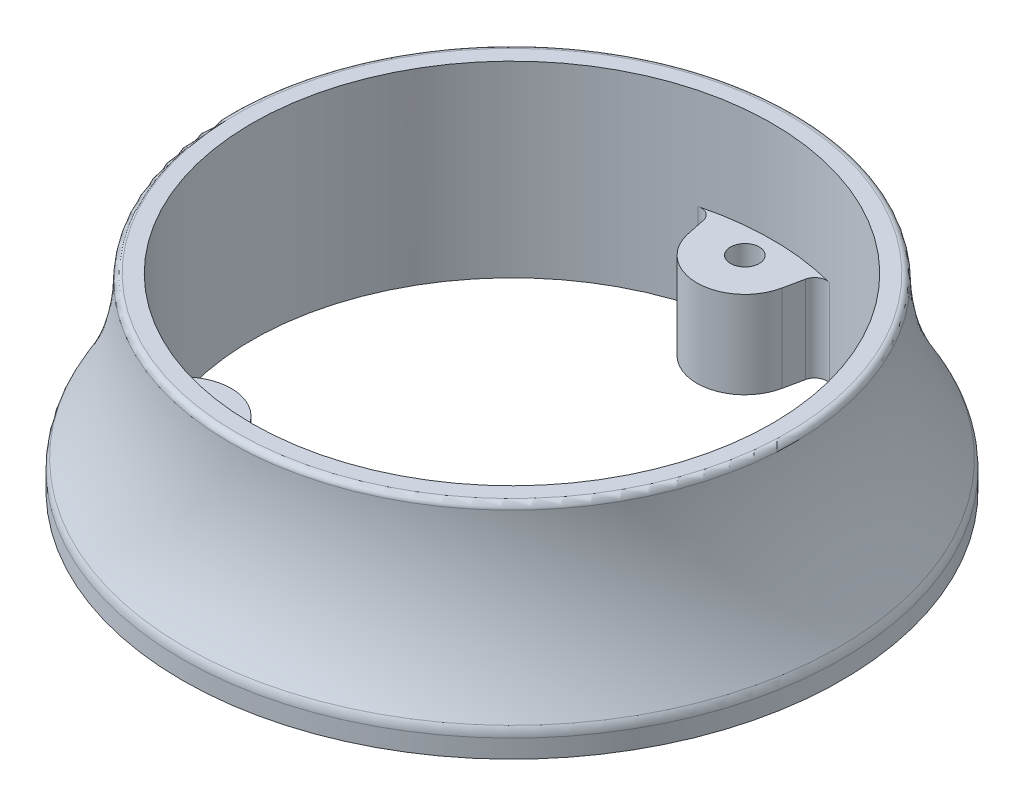
ISO-10303-21;
HEADER;
FILE_DESCRIPTION(('STEP AP214'),'2;1');
FILE_NAME('part.step','',(''),(''),'','','');
FILE_SCHEMA(('AUTOMOTIVE_DESIGN { 1 0 10303 214 1 1 1 1 }'));
ENDSEC;
DATA;
#1=APPLICATION_CONTEXT('core data for automotive mechanical design processes');
#2=APPLICATION_PROTOCOL_DEFINITION('international standard','automotive_design',2000,#1);
#3=PRODUCT_CONTEXT('',#1,'mechanical');
#4=PRODUCT('Part','Part','',(#3));
#5=PRODUCT_RELATED_PRODUCT_CATEGORY('part','',(#4));
#6=PRODUCT_DEFINITION_FORMATION('','',#4);
#7=PRODUCT_DEFINITION_CONTEXT('part definition',#1,'design');
#8=PRODUCT_DEFINITION('design','',#6,#7);
#9=PRODUCT_DEFINITION_SHAPE('','',#8);
#10=(LENGTH_UNIT() NAMED_UNIT(*) SI_UNIT(.MILLI.,.METRE.));
#11=(NAMED_UNIT(*) PLANE_ANGLE_UNIT() SI_UNIT($,.RADIAN.));
#12=(NAMED_UNIT(*) SI_UNIT($,.STERADIAN.) SOLID_ANGLE_UNIT());
#13=UNCERTAINTY_MEASURE_WITH_UNIT(LENGTH_MEASURE(1.E-05),#10,'distance_accuracy_value','');
#14=(GEOMETRIC_REPRESENTATION_CONTEXT(3) GLOBAL_UNCERTAINTY_ASSIGNED_CONTEXT((#13)) GLOBAL_UNIT_ASSIGNED_CONTEXT((#10,
#11,#12)) REPRESENTATION_CONTEXT('',''));
#15=CARTESIAN_POINT('',(0.,0.,0.));
#16=DIRECTION('',(0.,0.,1.));
#17=DIRECTION('',(1.,0.,0.));
#18=AXIS2_PLACEMENT_3D('',#15,#16,#17);
#19=CARTESIAN_POINT('',(0.,8.4,0.));
#20=DIRECTION('',(0.,1.,0.));
#21=DIRECTION('',(0.,0.,1.));
#22=AXIS2_PLACEMENT_3D('',#19,#20,#21);
#23=PLANE('',#22);
#24=CARTESIAN_POINT('',(0.,8.4,0.));
#25=DIRECTION('',(0.,1.,0.));
#26=DIRECTION('',(0.,0.,1.));
#27=AXIS2_PLACEMENT_3D('',#24,#25,#26);
#28=CIRCLE('',#27,23.0046614407208);
#29=CARTESIAN_POINT('',(0.,8.4,23.0046614407208));
#30=VERTEX_POINT('',#29);
#31=EDGE_CURVE('E11',#30,#30,#28,.T.);
#32=ORIENTED_EDGE('',*,*,#31,.T.);
#33=EDGE_LOOP('',(#32));
#34=FACE_BOUND('',#33,.T.);
#35=CARTESIAN_POINT('',(0.,8.4,0.));
#36=DIRECTION('',(0.,1.,0.));
#37=DIRECTION('',(0.,0.,1.));
#38=AXIS2_PLACEMENT_3D('',#35,#36,#37);
#39=CIRCLE('',#38,21.7);
#40=CARTESIAN_POINT('',(0.,8.4,21.7));
#41=VERTEX_POINT('',#40);
#42=CARTESIAN_POINT('',(-5.4879188385711,8.4,-20.9945885127872));
#43=VERTEX_POINT('',#42);
#44=EDGE_CURVE('E24',#41,#43,#39,.T.);
#45=ORIENTED_EDGE('',*,*,#44,.F.);
#46=EDGE_CURVE('E332',#43,#41,#39,.T.);
#47=ORIENTED_EDGE('',*,*,#46,.F.);
#48=EDGE_LOOP('',(#45,#47));
#49=FACE_BOUND('',#48,.T.);
#50=ADVANCED_FACE('F17',(#34,#49),#23,.T.);
#51=CARTESIAN_POINT('',(0.,8.4,0.));
#52=DIRECTION('',(0.,-1.,0.));
#53=DIRECTION('',(0.,0.,-1.));
#54=AXIS2_PLACEMENT_3D('',#51,#52,#53);
#55=CYLINDRICAL_SURFACE('',#54,21.7);
#56=ORIENTED_EDGE('',*,*,#44,.T.);
#57=CARTESIAN_POINT('',(-5.4879188385711,8.4,-20.9945885127872));
#58=CARTESIAN_POINT('',(-5.4879188385711,0.,-20.9945885127872));
#59=B_SPLINE_CURVE_WITH_KNOTS('',1,(#57,#58),.UNSPECIFIED.,.F.,.F.,(2,2),(0.,8.4),.UNSPECIFIED.);
#60=CARTESIAN_POINT('',(-5.48791883857111,0.,-20.9945885127872));
#61=VERTEX_POINT('',#60);
#62=EDGE_CURVE('E330',#43,#61,#59,.T.);
#63=ORIENTED_EDGE('',*,*,#62,.T.);
#64=CARTESIAN_POINT('',(0.,0.,0.));
#65=DIRECTION('',(0.,1.,0.));
#66=DIRECTION('',(0.,0.,1.));
#67=AXIS2_PLACEMENT_3D('',#64,#65,#66);
#68=CIRCLE('',#67,21.7);
#69=CARTESIAN_POINT('',(5.48791883857111,0.,-20.9945885127872));
#70=VERTEX_POINT('',#69);
#71=EDGE_CURVE('E336',#70,#61,#68,.T.);
#72=ORIENTED_EDGE('',*,*,#71,.F.);
#73=DIRECTION('',(0.,1.,0.));
#74=VECTOR('',#73,1.);
#75=CARTESIAN_POINT('',(5.48791883857111,-73.7275569029931,-20.9945885127872));
#76=LINE('',#75,#74);
#77=CARTESIAN_POINT('',(5.48791883857111,-7.2595194714576,-20.9945885127872));
#78=VERTEX_POINT('',#77);
#79=EDGE_CURVE('E338',#78,#70,#76,.T.);
#80=ORIENTED_EDGE('',*,*,#79,.F.);
#81=CARTESIAN_POINT('',(0.,-7.2595194714576,0.));
#82=DIRECTION('',(0.,1.,0.));
#83=DIRECTION('',(0.,0.,-1.));
#84=AXIS2_PLACEMENT_3D('',#81,#82,#83);
#85=CIRCLE('',#84,21.7);
#86=CARTESIAN_POINT('',(17.0181424196839,-7.2595194714576,13.4637598234429));
#87=VERTEX_POINT('',#86);
#88=EDGE_CURVE('E347',#87,#78,#85,.T.);
#89=ORIENTED_EDGE('',*,*,#88,.F.);
#90=DIRECTION('',(0.,1.,0.));
#91=VECTOR('',#90,1.);
#92=CARTESIAN_POINT('',(17.0181424196839,-73.7275569029931,13.4637598234429));
#93=LINE('',#92,#91);
#94=CARTESIAN_POINT('',(17.0181424196839,0.,13.4637598234429));
#95=VERTEX_POINT('',#94);
#96=EDGE_CURVE('E349',#87,#95,#93,.T.);
#97=ORIENTED_EDGE('',*,*,#96,.T.);
#98=CARTESIAN_POINT('',(0.,0.,0.));
#99=DIRECTION('',(0.,1.,0.));
#100=DIRECTION('',(0.,0.,1.));
#101=AXIS2_PLACEMENT_3D('',#98,#99,#100);
#102=CIRCLE('',#101,21.7);
#103=CARTESIAN_POINT('',(8.31635689970461,0.,20.0431586312321));
#104=VERTEX_POINT('',#103);
#105=EDGE_CURVE('E352',#104,#95,#102,.T.);
#106=ORIENTED_EDGE('',*,*,#105,.F.);
#107=DIRECTION('',(0.,1.,0.));
#108=VECTOR('',#107,1.);
#109=CARTESIAN_POINT('',(8.31635689970461,-73.7275569029931,20.0431586312321));
#110=LINE('',#109,#108);
#111=CARTESIAN_POINT('',(8.31635689970461,-7.2595194714576,20.0431586312321));
#112=VERTEX_POINT('',#111);
#113=EDGE_CURVE('E354',#112,#104,#110,.T.);
#114=ORIENTED_EDGE('',*,*,#113,.F.);
#115=CARTESIAN_POINT('',(0.,-7.2595194714576,0.));
#116=DIRECTION('',(0.,1.,0.));
#117=DIRECTION('',(0.,0.,-1.));
#118=AXIS2_PLACEMENT_3D('',#115,#116,#117);
#119=CIRCLE('',#118,21.7);
#120=CARTESIAN_POINT('',(-8.31737878503354,-7.2595194714576,20.0427345975112));
#121=VERTEX_POINT('',#120);
#122=EDGE_CURVE('E356',#121,#112,#119,.T.);
#123=ORIENTED_EDGE('',*,*,#122,.F.);
#124=DIRECTION('',(0.,1.,0.));
#125=VECTOR('',#124,1.);
#126=CARTESIAN_POINT('',(-8.31737878503354,-73.7275569029931,20.0427345975112));
#127=LINE('',#126,#125);
#128=CARTESIAN_POINT('',(-8.31737878503353,0.,20.0427345975112));
#129=VERTEX_POINT('',#128);
#130=EDGE_CURVE('E358',#121,#129,#127,.T.);
#131=ORIENTED_EDGE('',*,*,#130,.T.);
#132=CARTESIAN_POINT('',(0.,0.,0.));
#133=DIRECTION('',(0.,1.,0.));
#134=DIRECTION('',(0.,0.,1.));
#135=AXIS2_PLACEMENT_3D('',#132,#133,#134);
#136=CIRCLE('',#135,21.7);
#137=CARTESIAN_POINT('',(-17.0174559506621,0.,13.4646274722798));
#138=VERTEX_POINT('',#137);
#139=EDGE_CURVE('E361',#138,#129,#136,.T.);
#140=ORIENTED_EDGE('',*,*,#139,.F.);
#141=DIRECTION('',(0.,1.,0.));
#142=VECTOR('',#141,1.);
#143=CARTESIAN_POINT('',(-17.0174559506621,-73.7275569029931,13.4646274722798));
#144=LINE('',#143,#142);
#145=CARTESIAN_POINT('',(-17.0174559506621,-7.2595194714576,13.4646274722798));
#146=VERTEX_POINT('',#145);
#147=EDGE_CURVE('E363',#146,#138,#144,.T.);
#148=ORIENTED_EDGE('',*,*,#147,.F.);
#149=CARTESIAN_POINT('',(0.,-7.2595194714576,0.));
#150=DIRECTION('',(0.,1.,0.));
#151=DIRECTION('',(0.,0.,-1.));
#152=AXIS2_PLACEMENT_3D('',#149,#150,#151);
#153=CIRCLE('',#152,21.7);
#154=CARTESIAN_POINT('',(-5.48791883857111,-7.2595194714576,-20.9945885127872));
#155=VERTEX_POINT('',#154);
#156=EDGE_CURVE('E365',#155,#146,#153,.T.);
#157=ORIENTED_EDGE('',*,*,#156,.F.);
#158=DIRECTION('',(0.,1.,0.));
#159=VECTOR('',#158,1.);
#160=CARTESIAN_POINT('',(-5.48791883857111,-73.7275569029931,-20.9945885127872));
#161=LINE('',#160,#159);
#162=EDGE_CURVE('E334',#155,#61,#161,.T.);
#163=ORIENTED_EDGE('',*,*,#162,.T.);
#164=ORIENTED_EDGE('',*,*,#62,.F.);
#165=ORIENTED_EDGE('',*,*,#46,.T.);
#166=EDGE_LOOP('',(#56,#63,#72,#80,#89,#97,#106,#114,#123,#131,#140,#148,#157,#163,#164,#165));
#167=FACE_BOUND('',#166,.T.);
#168=ADVANCED_FACE('F320',(#167),#55,.F.);
#169=CARTESIAN_POINT('',(0.,0.,0.));
#170=DIRECTION('',(0.,1.,0.));
#171=DIRECTION('',(0.,0.,1.));
#172=AXIS2_PLACEMENT_3D('',#169,#170,#171);
#173=PLANE('',#172);
#174=CARTESIAN_POINT('',(11.811,0.,15.621));
#175=DIRECTION('',(0.,1.,0.));
#176=DIRECTION('',(0.,0.,1.));
#177=AXIS2_PLACEMENT_3D('',#174,#175,#176);
#178=CIRCLE('',#177,1.2);
#179=CARTESIAN_POINT('',(11.811,0.,16.821));
#180=VERTEX_POINT('',#179);
#181=EDGE_CURVE('E368',#180,#180,#178,.T.);
#182=ORIENTED_EDGE('',*,*,#181,.F.);
#183=EDGE_LOOP('',(#182));
#184=FACE_BOUND('',#183,.T.);
#185=CARTESIAN_POINT('',(7.933114646262,0.,19.1195107680417));
#186=DIRECTION('',(0.,1.,0.));
#187=DIRECTION('',(0.,0.,-1.));
#188=AXIS2_PLACEMENT_3D('',#185,#186,#187);
#189=CIRCLE('',#188,1.);
#190=CARTESIAN_POINT('',(8.83716996740658,0.,18.692095307032));
#191=VERTEX_POINT('',#190);
#192=EDGE_CURVE('E370',#104,#191,#189,.T.);
#193=ORIENTED_EDGE('',*,*,#192,.F.);
#194=ORIENTED_EDGE('',*,*,#105,.T.);
#195=CARTESIAN_POINT('',(16.2338962252284,0.,12.843310061994));
#196=DIRECTION('',(0.,1.,0.));
#197=DIRECTION('',(0.,0.,1.));
#198=AXIS2_PLACEMENT_3D('',#195,#196,#197);
#199=CIRCLE('',#198,1.);
#200=CARTESIAN_POINT('',(15.576284592711,0.,13.5966671757042));
#201=VERTEX_POINT('',#200);
#202=EDGE_CURVE('E372',#201,#95,#199,.T.);
#203=ORIENTED_EDGE('',*,*,#202,.F.);
#204=DIRECTION('',(0.753357113710265,0.,0.657611632517354));
#205=VECTOR('',#204,1.);
#206=CARTESIAN_POINT('',(14.4421965240399,0.,12.6067123552283));
#207=LINE('',#206,#205);
#208=CARTESIAN_POINT('',(14.4421965240399,0.,12.6067123552283));
#209=VERTEX_POINT('',#208);
#210=EDGE_CURVE('E375',#209,#201,#207,.T.);
#211=ORIENTED_EDGE('',*,*,#210,.F.);
#212=CARTESIAN_POINT('',(11.811,0.,15.621));
#213=DIRECTION('',(0.,-1.,0.));
#214=DIRECTION('',(0.,0.,1.));
#215=AXIS2_PLACEMENT_3D('',#212,#213,#214);
#216=CIRCLE('',#215,4.00114048160556);
#217=CARTESIAN_POINT('',(8.1937476569575,0.,17.3311493035102));
#218=VERTEX_POINT('',#217);
#219=EDGE_CURVE('E378',#218,#209,#216,.T.);
#220=ORIENTED_EDGE('',*,*,#219,.F.);
#221=DIRECTION('',(-0.427415461009738,0.,-0.904055321144582));
#222=VECTOR('',#221,1.);
#223=CARTESIAN_POINT('',(8.1937476569575,0.,17.3311493035102));
#224=LINE('',#223,#222);
#225=EDGE_CURVE('E381',#191,#218,#224,.T.);
#226=ORIENTED_EDGE('',*,*,#225,.F.);
#227=EDGE_LOOP('',(#193,#194,#203,#211,#220,#226));
#228=FACE_BOUND('',#227,.T.);
#229=ADVANCED_FACE('F317',(#184,#228),#173,.T.);
#230=CARTESIAN_POINT('',(0.,0.,0.));
#231=DIRECTION('',(0.,1.,0.));
#232=DIRECTION('',(0.,0.,1.));
#233=AXIS2_PLACEMENT_3D('',#230,#231,#232);
#234=PLANE('',#233);
#235=CARTESIAN_POINT('',(0.,0.,-19.431));
#236=DIRECTION('',(0.,1.,0.));
#237=DIRECTION('',(0.,0.,1.));
#238=AXIS2_PLACEMENT_3D('',#235,#236,#237);
#239=CIRCLE('',#238,1.2);
#240=CARTESIAN_POINT('',(0.,0.,-18.231));
#241=VERTEX_POINT('',#240);
#242=EDGE_CURVE('E384',#241,#241,#239,.T.);
#243=ORIENTED_EDGE('',*,*,#242,.F.);
#244=EDGE_LOOP('',(#243));
#245=FACE_BOUND('',#244,.T.);
#246=CARTESIAN_POINT('',(5.23501935292267,0.,-20.0270959545942));
#247=DIRECTION('',(0.,1.,0.));
#248=DIRECTION('',(0.,0.,-1.));
#249=AXIS2_PLACEMENT_3D('',#246,#247,#248);
#250=CIRCLE('',#249,1.);
#251=CARTESIAN_POINT('',(4.25643904354521,0.,-20.2329613914667));
#252=VERTEX_POINT('',#251);
#253=EDGE_CURVE('E386',#70,#252,#250,.T.);
#254=ORIENTED_EDGE('',*,*,#253,.F.);
#255=ORIENTED_EDGE('',*,*,#71,.T.);
#256=CARTESIAN_POINT('',(-5.23501935292267,0.,-20.0270959545942));
#257=DIRECTION('',(0.,1.,0.));
#258=DIRECTION('',(0.,0.,1.));
#259=AXIS2_PLACEMENT_3D('',#256,#257,#258);
#260=CIRCLE('',#259,1.);
#261=CARTESIAN_POINT('',(-4.25643904354521,0.,-20.2329613914667));
#262=VERTEX_POINT('',#261);
#263=EDGE_CURVE('E388',#262,#61,#260,.T.);
#264=ORIENTED_EDGE('',*,*,#263,.F.);
#265=DIRECTION('',(-0.205865436872503,0.,-0.978580309377464));
#266=VECTOR('',#265,1.);
#267=CARTESIAN_POINT('',(-3.91448887210358,0.,-18.6075029869641));
#268=LINE('',#267,#266);
#269=CARTESIAN_POINT('',(-3.91448887210358,0.,-18.6075029869641));
#270=VERTEX_POINT('',#269);
#271=EDGE_CURVE('E391',#270,#262,#268,.T.);
#272=ORIENTED_EDGE('',*,*,#271,.F.);
#273=CARTESIAN_POINT('',(0.,0.,-19.431));
#274=DIRECTION('',(0.,-1.,0.));
#275=DIRECTION('',(0.,0.,1.));
#276=AXIS2_PLACEMENT_3D('',#273,#274,#275);
#277=CIRCLE('',#276,4.0001713038696);
#278=CARTESIAN_POINT('',(3.91448887210358,0.,-18.6075029869641));
#279=VERTEX_POINT('',#278);
#280=EDGE_CURVE('E394',#279,#270,#277,.T.);
#281=ORIENTED_EDGE('',*,*,#280,.F.);
#282=DIRECTION('',(-0.205865436872503,0.,0.978580309377464));
#283=VECTOR('',#282,1.);
#284=CARTESIAN_POINT('',(3.91448887210358,0.,-18.6075029869641));
#285=LINE('',#284,#283);
#286=EDGE_CURVE('E397',#252,#279,#285,.T.);
#287=ORIENTED_EDGE('',*,*,#286,.F.);
#288=EDGE_LOOP('',(#254,#255,#264,#272,#281,#287));
#289=FACE_BOUND('',#288,.T.);
#290=ADVANCED_FACE('F313',(#245,#289),#234,.T.);
#291=CARTESIAN_POINT('',(0.,0.,0.));
#292=DIRECTION('',(0.,1.,0.));
#293=DIRECTION('',(0.,0.,1.));
#294=AXIS2_PLACEMENT_3D('',#291,#292,#293);
#295=PLANE('',#294);
#296=CARTESIAN_POINT('',(-11.811,0.,15.621));
#297=DIRECTION('',(0.,1.,0.));
#298=DIRECTION('',(0.,0.,1.));
#299=AXIS2_PLACEMENT_3D('',#296,#297,#298);
#300=CIRCLE('',#299,1.2);
#301=CARTESIAN_POINT('',(-11.811,0.,16.821));
#302=VERTEX_POINT('',#301);
#303=EDGE_CURVE('E400',#302,#302,#300,.T.);
#304=ORIENTED_EDGE('',*,*,#303,.F.);
#305=EDGE_LOOP('',(#304));
#306=FACE_BOUND('',#305,.T.);
#307=CARTESIAN_POINT('',(-16.2332413907238,0.,12.8441377270135));
#308=DIRECTION('',(0.,1.,0.));
#309=DIRECTION('',(0.,0.,-1.));
#310=AXIS2_PLACEMENT_3D('',#307,#308,#309);
#311=CIRCLE('',#310,1.);
#312=CARTESIAN_POINT('',(-15.5755913493106,0.,13.5974613115568));
#313=VERTEX_POINT('',#312);
#314=EDGE_CURVE('E402',#138,#313,#311,.T.);
#315=ORIENTED_EDGE('',*,*,#314,.F.);
#316=ORIENTED_EDGE('',*,*,#139,.T.);
#317=CARTESIAN_POINT('',(-7.93408944010111,0.,19.1191062750453));
#318=DIRECTION('',(0.,1.,0.));
#319=DIRECTION('',(0.,0.,1.));
#320=AXIS2_PLACEMENT_3D('',#317,#318,#319);
#321=CIRCLE('',#320,1.);
#322=CARTESIAN_POINT('',(-8.83812296838519,0.,18.6916447215247));
#323=VERTEX_POINT('',#322);
#324=EDGE_CURVE('E404',#323,#129,#321,.T.);
#325=ORIENTED_EDGE('',*,*,#324,.F.);
#326=DIRECTION('',(-0.427461553520588,0.,0.904033528284082));
#327=VECTOR('',#326,1.);
#328=CARTESIAN_POINT('',(-8.19471846157961,0.,17.3309159223829));
#329=LINE('',#328,#327);
#330=CARTESIAN_POINT('',(-8.19471846157961,0.,17.3309159223829));
#331=VERTEX_POINT('',#330);
#332=EDGE_CURVE('E407',#331,#323,#329,.T.);
#333=ORIENTED_EDGE('',*,*,#332,.F.);
#334=CARTESIAN_POINT('',(-11.811,0.,15.621));
#335=DIRECTION('',(0.,-1.,0.));
#336=DIRECTION('',(0.,0.,1.));
#337=AXIS2_PLACEMENT_3D('',#334,#335,#336);
#338=CIRCLE('',#337,4.00016307501818);
#339=CARTESIAN_POINT('',(-14.4417074119456,0.,12.6075828135697));
#340=VERTEX_POINT('',#339);
#341=EDGE_CURVE('E410',#340,#331,#338,.T.);
#342=ORIENTED_EDGE('',*,*,#341,.F.);
#343=DIRECTION('',(0.753323584543268,0.,-0.657650041413275));
#344=VECTOR('',#343,1.);
#345=CARTESIAN_POINT('',(-14.4417074119456,0.,12.6075828135697));
#346=LINE('',#345,#344);
#347=EDGE_CURVE('E413',#313,#340,#346,.T.);
#348=ORIENTED_EDGE('',*,*,#347,.F.);
#349=EDGE_LOOP('',(#315,#316,#325,#333,#342,#348));
#350=FACE_BOUND('',#349,.T.);
#351=ADVANCED_FACE('F309',(#306,#350),#295,.T.);
#352=CARTESIAN_POINT('',(-5.23501935292267,-73.7275569029931,-20.0270959545942));
#353=DIRECTION('',(0.,1.,0.));
#354=DIRECTION('',(0.,0.,1.));
#355=AXIS2_PLACEMENT_3D('',#352,#353,#354);
#356=CYLINDRICAL_SURFACE('',#355,1.);
#357=CARTESIAN_POINT('',(-5.23501935292267,-7.2595194714576,-20.0270959545942));
#358=DIRECTION('',(0.,1.,0.));
#359=DIRECTION('',(0.,0.,-1.));
#360=AXIS2_PLACEMENT_3D('',#357,#358,#359);
#361=CIRCLE('',#360,1.);
#362=CARTESIAN_POINT('',(-4.25643904354521,-7.2595194714576,-20.2329613914667));
#363=VERTEX_POINT('',#362);
#364=EDGE_CURVE('E416',#363,#155,#361,.T.);
#365=ORIENTED_EDGE('',*,*,#364,.F.);
#366=DIRECTION('',(0.,1.,0.));
#367=VECTOR('',#366,1.);
#368=CARTESIAN_POINT('',(-4.25643904354521,-73.7275569029931,-20.2329613914667));
#369=LINE('',#368,#367);
#370=EDGE_CURVE('E419',#363,#262,#369,.T.);
#371=ORIENTED_EDGE('',*,*,#370,.T.);
#372=ORIENTED_EDGE('',*,*,#263,.T.);
#373=ORIENTED_EDGE('',*,*,#162,.F.);
#374=EDGE_LOOP('',(#365,#371,#372,#373));
#375=FACE_BOUND('',#374,.T.);
#376=ADVANCED_FACE('F305',(#375),#356,.F.);
#377=CARTESIAN_POINT('',(-3.91448887210358,-73.7275569029931,-18.6075029869641));
#378=DIRECTION('',(0.978580309377464,0.,-0.205865436872503));
#379=DIRECTION('',(-0.205865436872503,0.,-0.978580309377464));
#380=AXIS2_PLACEMENT_3D('',#377,#378,#379);
#381=PLANE('',#380);
#382=DIRECTION('',(-0.205865436872503,0.,-0.978580309377464));
#383=VECTOR('',#382,1.);
#384=CARTESIAN_POINT('',(-3.91448887210358,-7.2595194714576,-18.6075029869641));
#385=LINE('',#384,#383);
#386=CARTESIAN_POINT('',(-3.91448887210358,-7.2595194714576,-18.6075029869641));
#387=VERTEX_POINT('',#386);
#388=EDGE_CURVE('E422',#387,#363,#385,.T.);
#389=ORIENTED_EDGE('',*,*,#388,.F.);
#390=DIRECTION('',(0.,1.,0.));
#391=VECTOR('',#390,1.);
#392=CARTESIAN_POINT('',(-3.91448887210358,-73.7275569029931,-18.6075029869641));
#393=LINE('',#392,#391);
#394=EDGE_CURVE('E425',#387,#270,#393,.T.);
#395=ORIENTED_EDGE('',*,*,#394,.T.);
#396=ORIENTED_EDGE('',*,*,#271,.T.);
#397=ORIENTED_EDGE('',*,*,#370,.F.);
#398=EDGE_LOOP('',(#389,#395,#396,#397));
#399=FACE_BOUND('',#398,.T.);
#400=ADVANCED_FACE('F301',(#399),#381,.F.);
#401=CARTESIAN_POINT('',(0.,-73.7275569029931,-19.431));
#402=DIRECTION('',(0.,1.,0.));
#403=DIRECTION('',(0.,0.,1.));
#404=AXIS2_PLACEMENT_3D('',#401,#402,#403);
#405=CYLINDRICAL_SURFACE('',#404,4.0001713038696);
#406=CARTESIAN_POINT('',(0.,-7.2595194714576,-19.431));
#407=DIRECTION('',(0.,-1.,0.));
#408=DIRECTION('',(0.,0.,-1.));
#409=AXIS2_PLACEMENT_3D('',#406,#407,#408);
#410=CIRCLE('',#409,4.0001713038696);
#411=CARTESIAN_POINT('',(3.91448887210358,-7.2595194714576,-18.6075029869641));
#412=VERTEX_POINT('',#411);
#413=EDGE_CURVE('E428',#412,#387,#410,.T.);
#414=ORIENTED_EDGE('',*,*,#413,.F.);
#415=DIRECTION('',(0.,1.,0.));
#416=VECTOR('',#415,1.);
#417=CARTESIAN_POINT('',(3.91448887210358,-73.7275569029931,-18.6075029869641));
#418=LINE('',#417,#416);
#419=EDGE_CURVE('E431',#412,#279,#418,.T.);
#420=ORIENTED_EDGE('',*,*,#419,.T.);
#421=ORIENTED_EDGE('',*,*,#280,.T.);
#422=ORIENTED_EDGE('',*,*,#394,.F.);
#423=EDGE_LOOP('',(#414,#420,#421,#422));
#424=FACE_BOUND('',#423,.T.);
#425=ADVANCED_FACE('F297',(#424),#405,.T.);
#426=CARTESIAN_POINT('',(3.91448887210358,-73.7275569029931,-18.6075029869641));
#427=DIRECTION('',(-0.978580309377464,0.,-0.205865436872503));
#428=DIRECTION('',(-0.205865436872503,0.,0.978580309377464));
#429=AXIS2_PLACEMENT_3D('',#426,#427,#428);
#430=PLANE('',#429);
#431=DIRECTION('',(-0.205865436872503,0.,0.978580309377464));
#432=VECTOR('',#431,1.);
#433=CARTESIAN_POINT('',(3.91448887210358,-7.2595194714576,-18.6075029869641));
#434=LINE('',#433,#432);
#435=CARTESIAN_POINT('',(4.25643904354521,-7.2595194714576,-20.2329613914667));
#436=VERTEX_POINT('',#435);
#437=EDGE_CURVE('E434',#436,#412,#434,.T.);
#438=ORIENTED_EDGE('',*,*,#437,.F.);
#439=DIRECTION('',(0.,1.,0.));
#440=VECTOR('',#439,1.);
#441=CARTESIAN_POINT('',(4.25643904354521,-73.7275569029931,-20.2329613914667));
#442=LINE('',#441,#440);
#443=EDGE_CURVE('E437',#436,#252,#442,.T.);
#444=ORIENTED_EDGE('',*,*,#443,.T.);
#445=ORIENTED_EDGE('',*,*,#286,.T.);
#446=ORIENTED_EDGE('',*,*,#419,.F.);
#447=EDGE_LOOP('',(#438,#444,#445,#446));
#448=FACE_BOUND('',#447,.T.);
#449=ADVANCED_FACE('F293',(#448),#430,.F.);
#450=CARTESIAN_POINT('',(5.23501935292267,-73.7275569029931,-20.0270959545942));
#451=DIRECTION('',(0.,1.,0.));
#452=DIRECTION('',(0.,0.,1.));
#453=AXIS2_PLACEMENT_3D('',#450,#451,#452);
#454=CYLINDRICAL_SURFACE('',#453,1.);
#455=CARTESIAN_POINT('',(5.23501935292267,-7.2595194714576,-20.0270959545942));
#456=DIRECTION('',(0.,1.,0.));
#457=DIRECTION('',(0.,0.,-1.));
#458=AXIS2_PLACEMENT_3D('',#455,#456,#457);
#459=CIRCLE('',#458,1.);
#460=EDGE_CURVE('E440',#78,#436,#459,.T.);
#461=ORIENTED_EDGE('',*,*,#460,.F.);
#462=ORIENTED_EDGE('',*,*,#79,.T.);
#463=ORIENTED_EDGE('',*,*,#253,.T.);
#464=ORIENTED_EDGE('',*,*,#443,.F.);
#465=EDGE_LOOP('',(#461,#462,#463,#464));
#466=FACE_BOUND('',#465,.T.);
#467=ADVANCED_FACE('F289',(#466),#454,.F.);
#468=CARTESIAN_POINT('',(16.2338962252284,-73.7275569029931,12.843310061994));
#469=DIRECTION('',(0.,1.,0.));
#470=DIRECTION('',(0.,0.,1.));
#471=AXIS2_PLACEMENT_3D('',#468,#469,#470);
#472=CYLINDRICAL_SURFACE('',#471,1.);
#473=CARTESIAN_POINT('',(16.2338962252284,-7.2595194714576,12.843310061994));
#474=DIRECTION('',(0.,1.,0.));
#475=DIRECTION('',(0.,0.,-1.));
#476=AXIS2_PLACEMENT_3D('',#473,#474,#475);
#477=CIRCLE('',#476,1.);
#478=CARTESIAN_POINT('',(15.576284592711,-7.2595194714576,13.5966671757042));
#479=VERTEX_POINT('',#478);
#480=EDGE_CURVE('E443',#479,#87,#477,.T.);
#481=ORIENTED_EDGE('',*,*,#480,.F.);
#482=DIRECTION('',(0.,1.,0.));
#483=VECTOR('',#482,1.);
#484=CARTESIAN_POINT('',(15.576284592711,-73.7275569029931,13.5966671757042));
#485=LINE('',#484,#483);
#486=EDGE_CURVE('E446',#479,#201,#485,.T.);
#487=ORIENTED_EDGE('',*,*,#486,.T.);
#488=ORIENTED_EDGE('',*,*,#202,.T.);
#489=ORIENTED_EDGE('',*,*,#96,.F.);
#490=EDGE_LOOP('',(#481,#487,#488,#489));
#491=FACE_BOUND('',#490,.T.);
#492=ADVANCED_FACE('F285',(#491),#472,.F.);
#493=CARTESIAN_POINT('',(14.4421965240399,-73.7275569029931,12.6067123552283));
#494=DIRECTION('',(-0.657611632517354,0.,0.753357113710265));
#495=DIRECTION('',(0.753357113710265,0.,0.657611632517354));
#496=AXIS2_PLACEMENT_3D('',#493,#494,#495);
#497=PLANE('',#496);
#498=DIRECTION('',(0.753357113710265,0.,0.657611632517354));
#499=VECTOR('',#498,1.);
#500=CARTESIAN_POINT('',(14.4421965240399,-7.2595194714576,12.6067123552283));
#501=LINE('',#500,#499);
#502=CARTESIAN_POINT('',(14.4421965240399,-7.2595194714576,12.6067123552283));
#503=VERTEX_POINT('',#502);
#504=EDGE_CURVE('E449',#503,#479,#501,.T.);
#505=ORIENTED_EDGE('',*,*,#504,.F.);
#506=DIRECTION('',(0.,1.,0.));
#507=VECTOR('',#506,1.);
#508=CARTESIAN_POINT('',(14.4421965240399,-73.7275569029931,12.6067123552283));
#509=LINE('',#508,#507);
#510=EDGE_CURVE('E452',#503,#209,#509,.T.);
#511=ORIENTED_EDGE('',*,*,#510,.T.);
#512=ORIENTED_EDGE('',*,*,#210,.T.);
#513=ORIENTED_EDGE('',*,*,#486,.F.);
#514=EDGE_LOOP('',(#505,#511,#512,#513));
#515=FACE_BOUND('',#514,.T.);
#516=ADVANCED_FACE('F281',(#515),#497,.F.);
#517=CARTESIAN_POINT('',(11.811,-73.7275569029931,15.621));
#518=DIRECTION('',(0.,1.,0.));
#519=DIRECTION('',(0.,0.,1.));
#520=AXIS2_PLACEMENT_3D('',#517,#518,#519);
#521=CYLINDRICAL_SURFACE('',#520,4.00114048160556);
#522=CARTESIAN_POINT('',(11.811,-7.2595194714576,15.621));
#523=DIRECTION('',(0.,-1.,0.));
#524=DIRECTION('',(0.,0.,-1.));
#525=AXIS2_PLACEMENT_3D('',#522,#523,#524);
#526=CIRCLE('',#525,4.00114048160556);
#527=CARTESIAN_POINT('',(8.1937476569575,-7.2595194714576,17.3311493035102));
#528=VERTEX_POINT('',#527);
#529=EDGE_CURVE('E455',#528,#503,#526,.T.);
#530=ORIENTED_EDGE('',*,*,#529,.F.);
#531=DIRECTION('',(0.,1.,0.));
#532=VECTOR('',#531,1.);
#533=CARTESIAN_POINT('',(8.1937476569575,-73.7275569029931,17.3311493035102));
#534=LINE('',#533,#532);
#535=EDGE_CURVE('E458',#528,#218,#534,.T.);
#536=ORIENTED_EDGE('',*,*,#535,.T.);
#537=ORIENTED_EDGE('',*,*,#219,.T.);
#538=ORIENTED_EDGE('',*,*,#510,.F.);
#539=EDGE_LOOP('',(#530,#536,#537,#538));
#540=FACE_BOUND('',#539,.T.);
#541=ADVANCED_FACE('F277',(#540),#521,.T.);
#542=CARTESIAN_POINT('',(8.1937476569575,-73.7275569029931,17.3311493035102));
#543=DIRECTION('',(0.904055321144582,0.,-0.427415461009738));
#544=DIRECTION('',(-0.427415461009738,0.,-0.904055321144582));
#545=AXIS2_PLACEMENT_3D('',#542,#543,#544);
#546=PLANE('',#545);
#547=DIRECTION('',(-0.427415461009738,0.,-0.904055321144582));
#548=VECTOR('',#547,1.);
#549=CARTESIAN_POINT('',(8.19374765695749,-7.2595194714576,17.3311493035102));
#550=LINE('',#549,#548);
#551=CARTESIAN_POINT('',(8.83716996740658,-7.2595194714576,18.692095307032));
#552=VERTEX_POINT('',#551);
#553=EDGE_CURVE('E461',#552,#528,#550,.T.);
#554=ORIENTED_EDGE('',*,*,#553,.F.);
#555=DIRECTION('',(0.,1.,0.));
#556=VECTOR('',#555,1.);
#557=CARTESIAN_POINT('',(8.83716996740658,-73.7275569029931,18.692095307032));
#558=LINE('',#557,#556);
#559=EDGE_CURVE('E464',#552,#191,#558,.T.);
#560=ORIENTED_EDGE('',*,*,#559,.T.);
#561=ORIENTED_EDGE('',*,*,#225,.T.);
#562=ORIENTED_EDGE('',*,*,#535,.F.);
#563=EDGE_LOOP('',(#554,#560,#561,#562));
#564=FACE_BOUND('',#563,.T.);
#565=ADVANCED_FACE('F273',(#564),#546,.F.);
#566=CARTESIAN_POINT('',(7.933114646262,-73.7275569029931,19.1195107680417));
#567=DIRECTION('',(0.,1.,0.));
#568=DIRECTION('',(0.,0.,1.));
#569=AXIS2_PLACEMENT_3D('',#566,#567,#568);
#570=CYLINDRICAL_SURFACE('',#569,1.);
#571=CARTESIAN_POINT('',(7.933114646262,-7.2595194714576,19.1195107680417));
#572=DIRECTION('',(0.,1.,0.));
#573=DIRECTION('',(0.,0.,-1.));
#574=AXIS2_PLACEMENT_3D('',#571,#572,#573);
#575=CIRCLE('',#574,1.);
#576=EDGE_CURVE('E467',#112,#552,#575,.T.);
#577=ORIENTED_EDGE('',*,*,#576,.F.);
#578=ORIENTED_EDGE('',*,*,#113,.T.);
#579=ORIENTED_EDGE('',*,*,#192,.T.);
#580=ORIENTED_EDGE('',*,*,#559,.F.);
#581=EDGE_LOOP('',(#577,#578,#579,#580));
#582=FACE_BOUND('',#581,.T.);
#583=ADVANCED_FACE('F269',(#582),#570,.F.);
#584=CARTESIAN_POINT('',(-7.93408944010111,-73.7275569029931,19.1191062750453));
#585=DIRECTION('',(0.,1.,0.));
#586=DIRECTION('',(0.,0.,1.));
#587=AXIS2_PLACEMENT_3D('',#584,#585,#586);
#588=CYLINDRICAL_SURFACE('',#587,1.);
#589=CARTESIAN_POINT('',(-7.93408944010111,-7.2595194714576,19.1191062750453));
#590=DIRECTION('',(0.,1.,0.));
#591=DIRECTION('',(0.,0.,-1.));
#592=AXIS2_PLACEMENT_3D('',#589,#590,#591);
#593=CIRCLE('',#592,1.);
#594=CARTESIAN_POINT('',(-8.83812296838519,-7.2595194714576,18.6916447215247));
#595=VERTEX_POINT('',#594);
#596=EDGE_CURVE('E470',#595,#121,#593,.T.);
#597=ORIENTED_EDGE('',*,*,#596,.F.);
#598=DIRECTION('',(0.,1.,0.));
#599=VECTOR('',#598,1.);
#600=CARTESIAN_POINT('',(-8.83812296838519,-73.7275569029931,18.6916447215247));
#601=LINE('',#600,#599);
#602=EDGE_CURVE('E473',#595,#323,#601,.T.);
#603=ORIENTED_EDGE('',*,*,#602,.T.);
#604=ORIENTED_EDGE('',*,*,#324,.T.);
#605=ORIENTED_EDGE('',*,*,#130,.F.);
#606=EDGE_LOOP('',(#597,#603,#604,#605));
#607=FACE_BOUND('',#606,.T.);
#608=ADVANCED_FACE('F265',(#607),#588,.F.);
#609=CARTESIAN_POINT('',(-8.19471846157961,-73.7275569029931,17.3309159223829));
#610=DIRECTION('',(-0.904033528284082,0.,-0.427461553520588));
#611=DIRECTION('',(-0.427461553520588,0.,0.904033528284082));
#612=AXIS2_PLACEMENT_3D('',#609,#610,#611);
#613=PLANE('',#612);
#614=DIRECTION('',(-0.427461553520588,0.,0.904033528284082));
#615=VECTOR('',#614,1.);
#616=CARTESIAN_POINT('',(-8.19471846157961,-7.2595194714576,17.3309159223829));
#617=LINE('',#616,#615);
#618=CARTESIAN_POINT('',(-8.19471846157961,-7.2595194714576,17.3309159223829));
#619=VERTEX_POINT('',#618);
#620=EDGE_CURVE('E476',#619,#595,#617,.T.);
#621=ORIENTED_EDGE('',*,*,#620,.F.);
#622=DIRECTION('',(0.,1.,0.));
#623=VECTOR('',#622,1.);
#624=CARTESIAN_POINT('',(-8.19471846157961,-73.7275569029931,17.3309159223829));
#625=LINE('',#624,#623);
#626=EDGE_CURVE('E479',#619,#331,#625,.T.);
#627=ORIENTED_EDGE('',*,*,#626,.T.);
#628=ORIENTED_EDGE('',*,*,#332,.T.);
#629=ORIENTED_EDGE('',*,*,#602,.F.);
#630=EDGE_LOOP('',(#621,#627,#628,#629));
#631=FACE_BOUND('',#630,.T.);
#632=ADVANCED_FACE('F261',(#631),#613,.F.);
#633=CARTESIAN_POINT('',(-11.811,-73.7275569029931,15.621));
#634=DIRECTION('',(0.,1.,0.));
#635=DIRECTION('',(0.,0.,1.));
#636=AXIS2_PLACEMENT_3D('',#633,#634,#635);
#637=CYLINDRICAL_SURFACE('',#636,4.00016307501818);
#638=CARTESIAN_POINT('',(-11.811,-7.2595194714576,15.621));
#639=DIRECTION('',(0.,-1.,0.));
#640=DIRECTION('',(0.,0.,-1.));
#641=AXIS2_PLACEMENT_3D('',#638,#639,#640);
#642=CIRCLE('',#641,4.00016307501818);
#643=CARTESIAN_POINT('',(-14.4417074119456,-7.2595194714576,12.6075828135697));
#644=VERTEX_POINT('',#643);
#645=EDGE_CURVE('E482',#644,#619,#642,.T.);
#646=ORIENTED_EDGE('',*,*,#645,.F.);
#647=DIRECTION('',(0.,1.,0.));
#648=VECTOR('',#647,1.);
#649=CARTESIAN_POINT('',(-14.4417074119456,-73.7275569029931,12.6075828135697));
#650=LINE('',#649,#648);
#651=EDGE_CURVE('E485',#644,#340,#650,.T.);
#652=ORIENTED_EDGE('',*,*,#651,.T.);
#653=ORIENTED_EDGE('',*,*,#341,.T.);
#654=ORIENTED_EDGE('',*,*,#626,.F.);
#655=EDGE_LOOP('',(#646,#652,#653,#654));
#656=FACE_BOUND('',#655,.T.);
#657=ADVANCED_FACE('F257',(#656),#637,.T.);
#658=CARTESIAN_POINT('',(-14.4417074119456,-73.7275569029931,12.6075828135697));
#659=DIRECTION('',(0.657650041413275,0.,0.753323584543268));
#660=DIRECTION('',(0.753323584543268,0.,-0.657650041413275));
#661=AXIS2_PLACEMENT_3D('',#658,#659,#660);
#662=PLANE('',#661);
#663=DIRECTION('',(0.753323584543268,0.,-0.657650041413275));
#664=VECTOR('',#663,1.);
#665=CARTESIAN_POINT('',(-14.4417074119456,-7.2595194714576,12.6075828135697));
#666=LINE('',#665,#664);
#667=CARTESIAN_POINT('',(-15.5755913493106,-7.2595194714576,13.5974613115568));
#668=VERTEX_POINT('',#667);
#669=EDGE_CURVE('E488',#668,#644,#666,.T.);
#670=ORIENTED_EDGE('',*,*,#669,.F.);
#671=DIRECTION('',(0.,1.,0.));
#672=VECTOR('',#671,1.);
#673=CARTESIAN_POINT('',(-15.5755913493106,-73.7275569029931,13.5974613115568));
#674=LINE('',#673,#672);
#675=EDGE_CURVE('E491',#668,#313,#674,.T.);
#676=ORIENTED_EDGE('',*,*,#675,.T.);
#677=ORIENTED_EDGE('',*,*,#347,.T.);
#678=ORIENTED_EDGE('',*,*,#651,.F.);
#679=EDGE_LOOP('',(#670,#676,#677,#678));
#680=FACE_BOUND('',#679,.T.);
#681=ADVANCED_FACE('F253',(#680),#662,.F.);
#682=CARTESIAN_POINT('',(-16.2332413907238,-73.7275569029931,12.8441377270135));
#683=DIRECTION('',(0.,1.,0.));
#684=DIRECTION('',(0.,0.,1.));
#685=AXIS2_PLACEMENT_3D('',#682,#683,#684);
#686=CYLINDRICAL_SURFACE('',#685,1.);
#687=CARTESIAN_POINT('',(-16.2332413907238,-7.2595194714576,12.8441377270135));
#688=DIRECTION('',(0.,1.,0.));
#689=DIRECTION('',(0.,0.,-1.));
#690=AXIS2_PLACEMENT_3D('',#687,#688,#689);
#691=CIRCLE('',#690,1.);
#692=EDGE_CURVE('E494',#146,#668,#691,.T.);
#693=ORIENTED_EDGE('',*,*,#692,.F.);
#694=ORIENTED_EDGE('',*,*,#147,.T.);
#695=ORIENTED_EDGE('',*,*,#314,.T.);
#696=ORIENTED_EDGE('',*,*,#675,.F.);
#697=EDGE_LOOP('',(#693,#694,#695,#696));
#698=FACE_BOUND('',#697,.T.);
#699=ADVANCED_FACE('F249',(#698),#686,.F.);
#700=CARTESIAN_POINT('',(0.,-73.7275569029931,-19.431));
#701=DIRECTION('',(0.,1.,0.));
#702=DIRECTION('',(0.,0.,1.));
#703=AXIS2_PLACEMENT_3D('',#700,#701,#702);
#704=CYLINDRICAL_SURFACE('',#703,1.2);
#705=CARTESIAN_POINT('',(0.,-7.25951947145759,-18.231));
#706=CARTESIAN_POINT('',(0.,0.,-18.231));
#707=B_SPLINE_CURVE_WITH_KNOTS('',1,(#705,#706),.UNSPECIFIED.,.F.,.F.,(2,2),(66.4680374315355,
73.7275569029931),.UNSPECIFIED.);
#708=CARTESIAN_POINT('',(0.,-7.25951947145759,-18.231));
#709=VERTEX_POINT('',#708);
#710=EDGE_CURVE('E497',#709,#241,#707,.T.);
#711=ORIENTED_EDGE('',*,*,#710,.F.);
#712=CARTESIAN_POINT('',(0.,-7.2595194714576,-19.431));
#713=DIRECTION('',(0.,1.,0.));
#714=DIRECTION('',(0.,0.,-1.));
#715=AXIS2_PLACEMENT_3D('',#712,#713,#714);
#716=CIRCLE('',#715,1.2);
#717=CARTESIAN_POINT('',(0.,-7.2595194714576,-20.631));
#718=VERTEX_POINT('',#717);
#719=EDGE_CURVE('E502',#718,#709,#716,.T.);
#720=ORIENTED_EDGE('',*,*,#719,.F.);
#721=EDGE_CURVE('E503',#709,#718,#716,.T.);
#722=ORIENTED_EDGE('',*,*,#721,.F.);
#723=ORIENTED_EDGE('',*,*,#710,.T.);
#724=ORIENTED_EDGE('',*,*,#242,.T.);
#725=EDGE_LOOP('',(#711,#720,#722,#723,#724));
#726=FACE_BOUND('',#725,.T.);
#727=ADVANCED_FACE('F245',(#726),#704,.F.);
#728=CARTESIAN_POINT('',(-11.811,-73.7275569029931,15.621));
#729=DIRECTION('',(0.,1.,0.));
#730=DIRECTION('',(0.,0.,1.));
#731=AXIS2_PLACEMENT_3D('',#728,#729,#730);
#732=CYLINDRICAL_SURFACE('',#731,1.2);
#733=CARTESIAN_POINT('',(-11.811,-7.25951947145759,16.821));
#734=CARTESIAN_POINT('',(-11.811,0.,16.821));
#735=B_SPLINE_CURVE_WITH_KNOTS('',1,(#733,#734),.UNSPECIFIED.,.F.,.F.,(2,2),(66.4680374315355,
73.7275569029931),.UNSPECIFIED.);
#736=CARTESIAN_POINT('',(-11.811,-7.25951947145759,16.821));
#737=VERTEX_POINT('',#736);
#738=EDGE_CURVE('E508',#737,#302,#735,.T.);
#739=ORIENTED_EDGE('',*,*,#738,.F.);
#740=CARTESIAN_POINT('',(-11.811,-7.2595194714576,15.621));
#741=DIRECTION('',(0.,1.,0.));
#742=DIRECTION('',(0.,0.,-1.));
#743=AXIS2_PLACEMENT_3D('',#740,#741,#742);
#744=CIRCLE('',#743,1.2);
#745=CARTESIAN_POINT('',(-11.811,-7.2595194714576,14.421));
#746=VERTEX_POINT('',#745);
#747=EDGE_CURVE('E513',#746,#737,#744,.T.);
#748=ORIENTED_EDGE('',*,*,#747,.F.);
#749=EDGE_CURVE('E514',#737,#746,#744,.T.);
#750=ORIENTED_EDGE('',*,*,#749,.F.);
#751=ORIENTED_EDGE('',*,*,#738,.T.);
#752=ORIENTED_EDGE('',*,*,#303,.T.);
#753=EDGE_LOOP('',(#739,#748,#750,#751,#752));
#754=FACE_BOUND('',#753,.T.);
#755=ADVANCED_FACE('F241',(#754),#732,.F.);
#756=CARTESIAN_POINT('',(11.811,-73.7275569029931,15.621));
#757=DIRECTION('',(0.,1.,0.));
#758=DIRECTION('',(0.,0.,1.));
#759=AXIS2_PLACEMENT_3D('',#756,#757,#758);
#760=CYLINDRICAL_SURFACE('',#759,1.2);
#761=CARTESIAN_POINT('',(11.811,-7.25951947145759,16.821));
#762=CARTESIAN_POINT('',(11.811,0.,16.821));
#763=B_SPLINE_CURVE_WITH_KNOTS('',1,(#761,#762),.UNSPECIFIED.,.F.,.F.,(2,2),(66.4680374315355,
73.7275569029931),.UNSPECIFIED.);
#764=CARTESIAN_POINT('',(11.811,-7.25951947145759,16.821));
#765=VERTEX_POINT('',#764);
#766=EDGE_CURVE('E519',#765,#180,#763,.T.);
#767=ORIENTED_EDGE('',*,*,#766,.F.);
#768=CARTESIAN_POINT('',(11.811,-7.2595194714576,15.621));
#769=DIRECTION('',(0.,1.,0.));
#770=DIRECTION('',(0.,0.,-1.));
#771=AXIS2_PLACEMENT_3D('',#768,#769,#770);
#772=CIRCLE('',#771,1.2);
#773=CARTESIAN_POINT('',(11.811,-7.2595194714576,14.421));
#774=VERTEX_POINT('',#773);
#775=EDGE_CURVE('E523',#774,#765,#772,.T.);
#776=ORIENTED_EDGE('',*,*,#775,.F.);
#777=EDGE_CURVE('E524',#765,#774,#772,.T.);
#778=ORIENTED_EDGE('',*,*,#777,.F.);
#779=ORIENTED_EDGE('',*,*,#766,.T.);
#780=ORIENTED_EDGE('',*,*,#181,.T.);
#781=EDGE_LOOP('',(#767,#776,#778,#779,#780));
#782=FACE_BOUND('',#781,.T.);
#783=ADVANCED_FACE('F237',(#782),#760,.F.);
#784=CARTESIAN_POINT('',(4.22700000000007,-7.25951947145761,10.364));
#785=DIRECTION('',(0.,-1.,0.));
#786=DIRECTION('',(0.,0.,-1.));
#787=AXIS2_PLACEMENT_3D('',#784,#785,#786);
#788=PLANE('',#787);
#789=ORIENTED_EDGE('',*,*,#747,.T.);
#790=ORIENTED_EDGE('',*,*,#749,.T.);
#791=EDGE_LOOP('',(#789,#790));
#792=FACE_BOUND('',#791,.T.);
#793=ORIENTED_EDGE('',*,*,#775,.T.);
#794=ORIENTED_EDGE('',*,*,#777,.T.);
#795=EDGE_LOOP('',(#793,#794));
#796=FACE_BOUND('',#795,.T.);
#797=ORIENTED_EDGE('',*,*,#719,.T.);
#798=ORIENTED_EDGE('',*,*,#721,.T.);
#799=EDGE_LOOP('',(#797,#798));
#800=FACE_BOUND('',#799,.T.);
#801=ORIENTED_EDGE('',*,*,#388,.T.);
#802=ORIENTED_EDGE('',*,*,#364,.T.);
#803=ORIENTED_EDGE('',*,*,#156,.T.);
#804=ORIENTED_EDGE('',*,*,#692,.T.);
#805=ORIENTED_EDGE('',*,*,#669,.T.);
#806=ORIENTED_EDGE('',*,*,#645,.T.);
#807=ORIENTED_EDGE('',*,*,#620,.T.);
#808=ORIENTED_EDGE('',*,*,#596,.T.);
#809=ORIENTED_EDGE('',*,*,#122,.T.);
#810=ORIENTED_EDGE('',*,*,#576,.T.);
#811=ORIENTED_EDGE('',*,*,#553,.T.);
#812=ORIENTED_EDGE('',*,*,#529,.T.);
#813=ORIENTED_EDGE('',*,*,#504,.T.);
#814=ORIENTED_EDGE('',*,*,#480,.T.);
#815=ORIENTED_EDGE('',*,*,#88,.T.);
#816=ORIENTED_EDGE('',*,*,#460,.T.);
#817=ORIENTED_EDGE('',*,*,#437,.T.);
#818=ORIENTED_EDGE('',*,*,#413,.T.);
#819=EDGE_LOOP('',(#801,#802,#803,#804,#805,#806,#807,#808,#809,#810,#811,#812,#813,#814,#815,
#816,#817,#818));
#820=FACE_BOUND('',#819,.T.);
#821=CARTESIAN_POINT('',(0.,-7.25951947145761,0.));
#822=DIRECTION('',(0.,1.,0.));
#823=DIRECTION('',(0.,0.,1.));
#824=AXIS2_PLACEMENT_3D('',#821,#822,#823);
#825=CIRCLE('',#824,27.5);
#826=CARTESIAN_POINT('',(0.,-7.25951947145761,27.5));
#827=VERTEX_POINT('',#826);
#828=EDGE_CURVE('E217',#827,#827,#825,.T.);
#829=ORIENTED_EDGE('',*,*,#828,.F.);
#830=EDGE_LOOP('',(#829));
#831=FACE_BOUND('',#830,.T.);
#832=ADVANCED_FACE('F232',(#792,#796,#800,#820,#831),#788,.T.);
#833=CARTESIAN_POINT('',(23.5,8.4,0.));
#834=CARTESIAN_POINT('',(23.5,6.04301240206172,0.));
#835=CARTESIAN_POINT('',(24.1308939179857,1.45873847640601,0.));
#836=CARTESIAN_POINT('',(26.0235756719103,-2.86613290874195,0.));
#837=CARTESIAN_POINT('',(27.2853635078691,-4.96371796621759,0.));
#838=B_SPLINE_CURVE_WITH_KNOTS('',3,(#833,#834,#835,#836,#837),.UNSPECIFIED.,.F.,.F.,(4,1,4),
(0.,0.486400266491094,0.972800532982188),.UNSPECIFIED.);
#839=CARTESIAN_POINT('',(0.,8.4,0.));
#840=DIRECTION('',(0.,1.,0.));
#841=AXIS1_PLACEMENT('',#839,#840);
#842=SURFACE_OF_REVOLUTION('',#838,#841);
#843=CARTESIAN_POINT('',(0.,7.90933883450641,23.5045742192853));
#844=CARTESIAN_POINT('',(0.,1.11028848140609,23.6315867879024));
#845=CARTESIAN_POINT('',(0.,-4.96371796621105,27.285363507867));
#846=B_SPLINE_CURVE_WITH_KNOTS('',2,(#843,#844,#845),.UNSPECIFIED.,.F.,.F.,(3,3),
(0.0338164874103945,0.972800532982188),.UNSPECIFIED.);
#847=CARTESIAN_POINT('',(0.,7.90933883451294,23.5045742192831));
#848=VERTEX_POINT('',#847);
#849=CARTESIAN_POINT('',(0.,-4.96371796621758,27.2853635078691));
#850=VERTEX_POINT('',#849);
#851=EDGE_CURVE('E208',#848,#850,#846,.T.);
#852=ORIENTED_EDGE('',*,*,#851,.T.);
#853=CARTESIAN_POINT('',(0.,-4.96371796621758,0.));
#854=DIRECTION('',(0.,1.,0.));
#855=DIRECTION('',(0.,0.,1.));
#856=AXIS2_PLACEMENT_3D('',#853,#854,#855);
#857=CIRCLE('',#856,27.2853635078691);
#858=EDGE_CURVE('E198',#850,#850,#857,.T.);
#859=ORIENTED_EDGE('',*,*,#858,.T.);
#860=ORIENTED_EDGE('',*,*,#851,.F.);
#861=CARTESIAN_POINT('',(0.,7.90933883451294,0.));
#862=DIRECTION('',(0.,-1.,0.));
#863=DIRECTION('',(0.,0.,1.));
#864=AXIS2_PLACEMENT_3D('',#861,#862,#863);
#865=CIRCLE('',#864,23.5045742192831);
#866=EDGE_CURVE('E195',#848,#848,#865,.T.);
#867=ORIENTED_EDGE('',*,*,#866,.T.);
#868=EDGE_LOOP('',(#852,#859,#860,#867));
#869=FACE_BOUND('',#868,.T.);
#870=ADVANCED_FACE('F227',(#869),#842,.F.);
#871=CARTESIAN_POINT('',(0.,8.4,0.));
#872=DIRECTION('',(0.,1.,0.));
#873=DIRECTION('',(0.,0.,1.));
#874=AXIS2_PLACEMENT_3D('',#871,#872,#873);
#875=CYLINDRICAL_SURFACE('',#874,27.5);
#876=CARTESIAN_POINT('',(0.,-5.73691952638052,0.));
#877=DIRECTION('',(0.,1.,0.));
#878=DIRECTION('',(0.,0.,1.));
#879=AXIS2_PLACEMENT_3D('',#876,#877,#878);
#880=CIRCLE('',#879,27.5);
#881=CARTESIAN_POINT('',(0.,-5.73691952638052,27.5));
#882=VERTEX_POINT('',#881);
#883=EDGE_CURVE('E186',#882,#882,#880,.T.);
#884=ORIENTED_EDGE('',*,*,#883,.F.);
#885=CARTESIAN_POINT('',(0.,-7.25951947145761,27.5));
#886=CARTESIAN_POINT('',(0.,-5.73691952638052,27.5));
#887=B_SPLINE_CURVE_WITH_KNOTS('',1,(#885,#886),.UNSPECIFIED.,.F.,.F.,(2,2),(-15.6595194714576,
-14.1369195263805),.UNSPECIFIED.);
#888=EDGE_CURVE('E196',#827,#882,#887,.T.);
#889=ORIENTED_EDGE('',*,*,#888,.F.);
#890=ORIENTED_EDGE('',*,*,#828,.T.);
#891=ORIENTED_EDGE('',*,*,#888,.T.);
#892=EDGE_LOOP('',(#884,#889,#890,#891));
#893=FACE_BOUND('',#892,.T.);
#894=ADVANCED_FACE('F231',(#893),#875,.T.);
#895=CARTESIAN_POINT('',(0.,-5.73691952638051,0.));
#896=DIRECTION('',(0.,1.,0.));
#897=DIRECTION('',(0.,0.,1.));
#898=AXIS2_PLACEMENT_3D('',#895,#896,#897);
#899=TOROIDAL_SURFACE('',#898,26.,1.5);
#900=ORIENTED_EDGE('',*,*,#858,.F.);
#901=CARTESIAN_POINT('',(0.,-5.73691952638051,27.5));
#902=CARTESIAN_POINT('',(0.,-5.71999597981269,27.5000001177638));
#903=CARTESIAN_POINT('',(0.,-5.7030724401514,27.4997135979132));
#904=CARTESIAN_POINT('',(0.,-5.66924474331343,27.4985681283518));
#905=CARTESIAN_POINT('',(0.,-5.65234058613676,27.4977091786411));
#906=CARTESIAN_POINT('',(0.,-5.61857102293958,27.4954196947286));
#907=CARTESIAN_POINT('',(0.,-5.60170561691909,27.4939891605268));
#908=CARTESIAN_POINT('',(0.,-5.56803287436649,27.4905581834619));
#909=CARTESIAN_POINT('',(0.,-5.5512255378344,27.4885577405988));
#910=CARTESIAN_POINT('',(0.,-5.51768818766547,27.483989227801));
#911=CARTESIAN_POINT('',(0.,-5.50095817402864,27.4814211578664));
#912=CARTESIAN_POINT('',(0.,-5.46759463405518,27.4757203353564));
#913=CARTESIAN_POINT('',(0.,-5.45096110771855,27.4725875827812));
#914=CARTESIAN_POINT('',(0.,-5.41780959633779,27.4657609828924));
#915=CARTESIAN_POINT('',(0.,-5.40129161129366,27.4620671355789));
#916=CARTESIAN_POINT('',(0.,-5.36839010410285,27.4541225777689));
#917=CARTESIAN_POINT('',(0.,-5.35200658195618,27.4498718672724));
#918=CARTESIAN_POINT('',(0.,-5.31939276815258,27.4408184522892));
#919=CARTESIAN_POINT('',(0.,-5.30316247649564,27.4360157478025));
#920=CARTESIAN_POINT('',(0.,-5.27087371570202,27.4258638464715));
#921=CARTESIAN_POINT('',(0.,-5.25481524656532,27.4205146496272));
#922=CARTESIAN_POINT('',(0.,-5.2228885261359,27.4092758909995));
#923=CARTESIAN_POINT('',(0.,-5.20702027484316,27.4033863292161));
#924=CARTESIAN_POINT('',(0.,-5.1754921670871,27.3910735879222));
#925=CARTESIAN_POINT('',(0.,-5.15983231062377,27.3846504084115));
#926=CARTESIAN_POINT('',(0.,-5.12873893243668,27.3712777871856));
#927=CARTESIAN_POINT('',(0.,-5.11330541071292,27.3643283454704));
#928=CARTESIAN_POINT('',(0.,-5.08268237650861,27.3499111692297));
#929=CARTESIAN_POINT('',(0.,-5.06749286402806,27.3424434347043));
#930=CARTESIAN_POINT('',(0.,-5.03737526619911,27.3269981947862));
#931=CARTESIAN_POINT('',(0.,-5.02244718085071,27.3190206893935));
#932=CARTESIAN_POINT('',(0.,-4.99286947023554,27.3025651672613));
#933=CARTESIAN_POINT('',(0.,-4.97821984496878,27.2940871505218));
#934=CARTESIAN_POINT('',(0.,-4.96371796621757,27.2853635078691));
#935=B_SPLINE_CURVE_WITH_KNOTS('',3,(#901,#902,#903,#904,#905,#906,#907,#908,#909,#910,#911,
#912,#913,#914,#915,#916,#917,#918,#919,#920,#921,#922,#923,#924,#925,#926,#927,#928,#929,#930,
#931,#932,#933,#934),.UNSPECIFIED.,.F.,.F.,(4,2,2,2,2,2,2,2,2,2,2,2,2,2,2,2,4),(0.,
0.0507682046413399,0.101536409282681,0.152304613924023,0.203072818565363,0.253841023206704,
0.304609227848045,0.355377432489385,0.406145637130727,0.456913841772066,0.507682046413409,
0.558450251054751,0.60921845569609,0.659986660337432,0.710754864978772,0.761523069620112,
0.812291274261453),.UNSPECIFIED.);
#936=EDGE_CURVE('E189',#882,#850,#935,.T.);
#937=ORIENTED_EDGE('',*,*,#936,.F.);
#938=ORIENTED_EDGE('',*,*,#883,.T.);
#939=ORIENTED_EDGE('',*,*,#936,.T.);
#940=EDGE_LOOP('',(#900,#937,#938,#939));
#941=FACE_BOUND('',#940,.T.);
#942=ADVANCED_FACE('F188',(#941),#899,.T.);
#943=CARTESIAN_POINT('',(0.,7.9,0.));
#944=DIRECTION('',(0.,1.,0.));
#945=DIRECTION('',(0.,0.,1.));
#946=AXIS2_PLACEMENT_3D('',#943,#944,#945);
#947=TOROIDAL_SURFACE('',#946,23.0046614407208,0.5);
#948=ORIENTED_EDGE('',*,*,#866,.F.);
#949=CARTESIAN_POINT('',(0.,7.90933883451294,23.5045742192832));
#950=CARTESIAN_POINT('',(0.,8.03865940249455,23.5021583910922));
#951=CARTESIAN_POINT('',(0.,8.16721988237308,23.4596072725064));
#952=CARTESIAN_POINT('',(0.,8.27951478859454,23.3771527561597));
#953=CARTESIAN_POINT('',(0.,8.35985751424684,23.2633373808184));
#954=CARTESIAN_POINT('',(0.,8.40000000000002,23.1340045716901));
#955=CARTESIAN_POINT('',(0.,8.4,23.0046614407208));
#956=B_SPLINE_CURVE_WITH_KNOTS('',6,(#949,#950,#951,#952,#953,#954,#955),.UNSPECIFIED.,.F.,.F.,
(7,7),(0.018678755163763,1.5707963267949),.UNSPECIFIED.);
#957=EDGE_CURVE('E565',#848,#30,#956,.T.);
#958=ORIENTED_EDGE('',*,*,#957,.T.);
#959=ORIENTED_EDGE('',*,*,#31,.F.);
#960=ORIENTED_EDGE('',*,*,#957,.F.);
#961=EDGE_LOOP('',(#948,#958,#959,#960));
#962=FACE_BOUND('',#961,.T.);
#963=ADVANCED_FACE('F538',(#962),#947,.T.);
#964=CLOSED_SHELL('',(#50,#168,#229,#290,#351,#376,#400,#425,#449,#467,#492,#516,#541,#565,#583,
#608,#632,#657,#681,#699,#727,#755,#783,#832,#870,#894,#942,#963));
#965=MANIFOLD_SOLID_BREP('B1',#964);
#966=ADVANCED_BREP_SHAPE_REPRESENTATION('',(#18,#965),#14);
#967=SHAPE_DEFINITION_REPRESENTATION(#9,#966);
ENDSEC;
END-ISO-10303-21;
